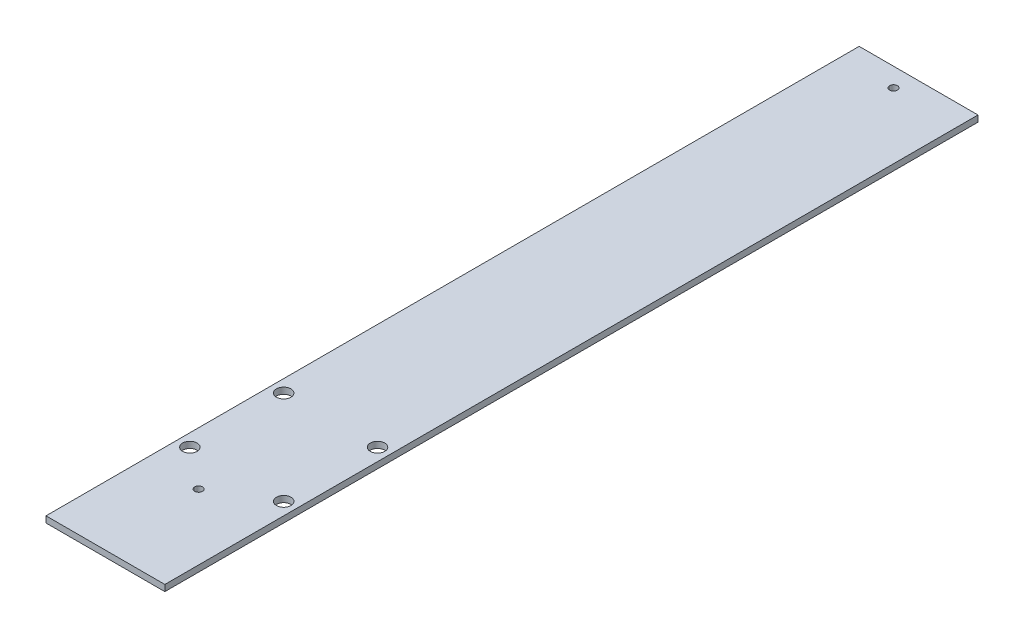
ISO-10303-21;
HEADER;
FILE_DESCRIPTION(('STEP AP214'),'2;1');
FILE_NAME('part.step','',(''),(''),'','','');
FILE_SCHEMA(('AUTOMOTIVE_DESIGN { 1 0 10303 214 1 1 1 1 }'));
ENDSEC;
DATA;
#1=APPLICATION_CONTEXT('core data for automotive mechanical design processes');
#2=APPLICATION_PROTOCOL_DEFINITION('international standard','automotive_design',2000,#1);
#3=PRODUCT_CONTEXT('',#1,'mechanical');
#4=PRODUCT('Part','Part','',(#3));
#5=PRODUCT_RELATED_PRODUCT_CATEGORY('part','',(#4));
#6=PRODUCT_DEFINITION_FORMATION('','',#4);
#7=PRODUCT_DEFINITION_CONTEXT('part definition',#1,'design');
#8=PRODUCT_DEFINITION('design','',#6,#7);
#9=PRODUCT_DEFINITION_SHAPE('','',#8);
#10=(LENGTH_UNIT() NAMED_UNIT(*) SI_UNIT(.MILLI.,.METRE.));
#11=(NAMED_UNIT(*) PLANE_ANGLE_UNIT() SI_UNIT($,.RADIAN.));
#12=(NAMED_UNIT(*) SI_UNIT($,.STERADIAN.) SOLID_ANGLE_UNIT());
#13=UNCERTAINTY_MEASURE_WITH_UNIT(LENGTH_MEASURE(1.E-05),#10,'distance_accuracy_value','');
#14=(GEOMETRIC_REPRESENTATION_CONTEXT(3) GLOBAL_UNCERTAINTY_ASSIGNED_CONTEXT((#13)) GLOBAL_UNIT_ASSIGNED_CONTEXT((#10,
#11,#12)) REPRESENTATION_CONTEXT('',''));
#15=CARTESIAN_POINT('',(0.,0.,0.));
#16=DIRECTION('',(0.,0.,1.));
#17=DIRECTION('',(1.,0.,0.));
#18=AXIS2_PLACEMENT_3D('',#15,#16,#17);
#19=CARTESIAN_POINT('',(107.95,0.,1449.0573));
#20=DIRECTION('',(0.,1.,0.));
#21=DIRECTION('',(0.,0.,1.));
#22=AXIS2_PLACEMENT_3D('',#19,#20,#21);
#23=CYLINDRICAL_SURFACE('',#22,7.93749999999992);
#24=DIRECTION('',(0.,1.,0.));
#25=VECTOR('',#24,1.);
#26=CARTESIAN_POINT('',(100.0125,0.,1449.0573));
#27=LINE('',#26,#25);
#28=CARTESIAN_POINT('',(100.0125,12.7,1449.0573));
#29=VERTEX_POINT('',#28);
#30=CARTESIAN_POINT('',(100.0125,0.,1449.0573));
#31=VERTEX_POINT('',#30);
#32=EDGE_CURVE('E11',#29,#31,#27,.F.);
#33=ORIENTED_EDGE('',*,*,#32,.F.);
#34=CARTESIAN_POINT('',(107.95,12.7,1449.0573));
#35=DIRECTION('',(0.,1.,0.));
#36=DIRECTION('',(0.,0.,1.));
#37=AXIS2_PLACEMENT_3D('',#34,#35,#36);
#38=CIRCLE('',#37,7.93749999999992);
#39=CARTESIAN_POINT('',(115.8875,12.7,1449.0573));
#40=VERTEX_POINT('',#39);
#41=EDGE_CURVE('E145',#29,#40,#38,.T.);
#42=ORIENTED_EDGE('',*,*,#41,.T.);
#43=DIRECTION('',(0.,1.,0.));
#44=VECTOR('',#43,1.);
#45=CARTESIAN_POINT('',(115.8875,0.,1449.0573));
#46=LINE('',#45,#44);
#47=CARTESIAN_POINT('',(115.8875,0.,1449.0573));
#48=VERTEX_POINT('',#47);
#49=EDGE_CURVE('E47',#48,#40,#46,.T.);
#50=ORIENTED_EDGE('',*,*,#49,.F.);
#51=CARTESIAN_POINT('',(107.95,0.,1449.0573));
#52=DIRECTION('',(0.,1.,0.));
#53=DIRECTION('',(0.,0.,1.));
#54=AXIS2_PLACEMENT_3D('',#51,#52,#53);
#55=CIRCLE('',#54,7.93749999999992);
#56=EDGE_CURVE('E231',#31,#48,#55,.T.);
#57=ORIENTED_EDGE('',*,*,#56,.F.);
#58=EDGE_LOOP('',(#33,#42,#50,#57));
#59=FACE_BOUND('',#58,.T.);
#60=ADVANCED_FACE('F38',(#59),#23,.F.);
#61=CARTESIAN_POINT('',(107.95,0.,38.1));
#62=DIRECTION('',(0.,1.,0.));
#63=DIRECTION('',(0.,0.,1.));
#64=AXIS2_PLACEMENT_3D('',#61,#62,#63);
#65=CYLINDRICAL_SURFACE('',#64,7.93749999999998);
#66=DIRECTION('',(0.,1.,0.));
#67=VECTOR('',#66,1.);
#68=CARTESIAN_POINT('',(100.0125,0.,38.1));
#69=LINE('',#68,#67);
#70=CARTESIAN_POINT('',(100.0125,12.7,38.1));
#71=VERTEX_POINT('',#70);
#72=CARTESIAN_POINT('',(100.0125,0.,38.1));
#73=VERTEX_POINT('',#72);
#74=EDGE_CURVE('E129',#71,#73,#69,.F.);
#75=ORIENTED_EDGE('',*,*,#74,.F.);
#76=CARTESIAN_POINT('',(107.95,12.7,38.1));
#77=DIRECTION('',(0.,1.,0.));
#78=DIRECTION('',(0.,0.,1.));
#79=AXIS2_PLACEMENT_3D('',#76,#77,#78);
#80=CIRCLE('',#79,7.93749999999998);
#81=CARTESIAN_POINT('',(115.8875,12.7,38.1));
#82=VERTEX_POINT('',#81);
#83=EDGE_CURVE('E157',#71,#82,#80,.T.);
#84=ORIENTED_EDGE('',*,*,#83,.T.);
#85=DIRECTION('',(0.,1.,0.));
#86=VECTOR('',#85,1.);
#87=CARTESIAN_POINT('',(115.8875,0.,38.1));
#88=LINE('',#87,#86);
#89=CARTESIAN_POINT('',(115.8875,0.,38.1));
#90=VERTEX_POINT('',#89);
#91=EDGE_CURVE('E126',#90,#82,#88,.T.);
#92=ORIENTED_EDGE('',*,*,#91,.F.);
#93=CARTESIAN_POINT('',(107.95,0.,38.1));
#94=DIRECTION('',(0.,1.,0.));
#95=DIRECTION('',(0.,0.,1.));
#96=AXIS2_PLACEMENT_3D('',#93,#94,#95);
#97=CIRCLE('',#96,7.93749999999998);
#98=EDGE_CURVE('E149',#73,#90,#97,.T.);
#99=ORIENTED_EDGE('',*,*,#98,.F.);
#100=EDGE_LOOP('',(#75,#84,#92,#99));
#101=FACE_BOUND('',#100,.T.);
#102=ADVANCED_FACE('F188',(#101),#65,.F.);
#103=CARTESIAN_POINT('',(0.,12.7,0.));
#104=DIRECTION('',(1.,0.,0.));
#105=DIRECTION('',(0.,0.,-1.));
#106=AXIS2_PLACEMENT_3D('',#103,#104,#105);
#107=PLANE('',#106);
#108=DIRECTION('',(0.,0.,1.));
#109=VECTOR('',#108,1.);
#110=CARTESIAN_POINT('',(0.,0.,0.));
#111=LINE('',#110,#109);
#112=CARTESIAN_POINT('',(0.,0.,0.));
#113=VERTEX_POINT('',#112);
#114=CARTESIAN_POINT('',(2.02189186539228E-13,0.,1651.));
#115=VERTEX_POINT('',#114);
#116=EDGE_CURVE('E125',#113,#115,#111,.T.);
#117=ORIENTED_EDGE('',*,*,#116,.T.);
#118=DIRECTION('',(0.,-1.,0.));
#119=VECTOR('',#118,1.);
#120=CARTESIAN_POINT('',(2.02189186539228E-13,12.7,1651.));
#121=LINE('',#120,#119);
#122=CARTESIAN_POINT('',(2.02189186539228E-13,12.7,1651.));
#123=VERTEX_POINT('',#122);
#124=EDGE_CURVE('E106',#123,#115,#121,.T.);
#125=ORIENTED_EDGE('',*,*,#124,.F.);
#126=DIRECTION('',(0.,0.,1.));
#127=VECTOR('',#126,1.);
#128=CARTESIAN_POINT('',(0.,12.7,0.));
#129=LINE('',#128,#127);
#130=CARTESIAN_POINT('',(0.,12.7,0.));
#131=VERTEX_POINT('',#130);
#132=EDGE_CURVE('E113',#131,#123,#129,.T.);
#133=ORIENTED_EDGE('',*,*,#132,.F.);
#134=DIRECTION('',(0.,-1.,0.));
#135=VECTOR('',#134,1.);
#136=CARTESIAN_POINT('',(0.,12.7,0.));
#137=LINE('',#136,#135);
#138=EDGE_CURVE('E163',#131,#113,#137,.T.);
#139=ORIENTED_EDGE('',*,*,#138,.T.);
#140=EDGE_LOOP('',(#117,#125,#133,#139));
#141=FACE_BOUND('',#140,.T.);
#142=ADVANCED_FACE('F40',(#141),#107,.F.);
#143=CARTESIAN_POINT('',(2.02189186539228E-13,12.7,1651.));
#144=DIRECTION('',(0.,0.,-1.));
#145=DIRECTION('',(-1.,0.,0.));
#146=AXIS2_PLACEMENT_3D('',#143,#144,#145);
#147=PLANE('',#146);
#148=DIRECTION('',(1.,0.,0.));
#149=VECTOR('',#148,1.);
#150=CARTESIAN_POINT('',(2.02189186539228E-13,0.,1651.));
#151=LINE('',#150,#149);
#152=CARTESIAN_POINT('',(241.3,0.,1651.));
#153=VERTEX_POINT('',#152);
#154=EDGE_CURVE('E165',#115,#153,#151,.T.);
#155=ORIENTED_EDGE('',*,*,#154,.T.);
#156=DIRECTION('',(0.,-1.,0.));
#157=VECTOR('',#156,1.);
#158=CARTESIAN_POINT('',(241.3,12.7,1651.));
#159=LINE('',#158,#157);
#160=CARTESIAN_POINT('',(241.3,12.7,1651.));
#161=VERTEX_POINT('',#160);
#162=EDGE_CURVE('E109',#161,#153,#159,.T.);
#163=ORIENTED_EDGE('',*,*,#162,.F.);
#164=DIRECTION('',(1.,0.,0.));
#165=VECTOR('',#164,1.);
#166=CARTESIAN_POINT('',(2.02189186539228E-13,12.7,1651.));
#167=LINE('',#166,#165);
#168=EDGE_CURVE('E102',#123,#161,#167,.T.);
#169=ORIENTED_EDGE('',*,*,#168,.F.);
#170=ORIENTED_EDGE('',*,*,#124,.T.);
#171=EDGE_LOOP('',(#155,#163,#169,#170));
#172=FACE_BOUND('',#171,.T.);
#173=ADVANCED_FACE('F104',(#172),#147,.F.);
#174=CARTESIAN_POINT('',(241.3,12.7,0.));
#175=DIRECTION('',(-1.,0.,0.));
#176=DIRECTION('',(0.,0.,1.));
#177=AXIS2_PLACEMENT_3D('',#174,#175,#176);
#178=PLANE('',#177);
#179=DIRECTION('',(0.,0.,-1.));
#180=VECTOR('',#179,1.);
#181=CARTESIAN_POINT('',(241.3,0.,0.));
#182=LINE('',#181,#180);
#183=CARTESIAN_POINT('',(241.3,0.,0.));
#184=VERTEX_POINT('',#183);
#185=EDGE_CURVE('E167',#153,#184,#182,.T.);
#186=ORIENTED_EDGE('',*,*,#185,.T.);
#187=DIRECTION('',(0.,-1.,0.));
#188=VECTOR('',#187,1.);
#189=CARTESIAN_POINT('',(241.3,12.7,0.));
#190=LINE('',#189,#188);
#191=CARTESIAN_POINT('',(241.3,12.7,0.));
#192=VERTEX_POINT('',#191);
#193=EDGE_CURVE('E131',#192,#184,#190,.T.);
#194=ORIENTED_EDGE('',*,*,#193,.F.);
#195=DIRECTION('',(0.,0.,-1.));
#196=VECTOR('',#195,1.);
#197=CARTESIAN_POINT('',(241.3,12.7,0.));
#198=LINE('',#197,#196);
#199=EDGE_CURVE('E112',#161,#192,#198,.T.);
#200=ORIENTED_EDGE('',*,*,#199,.F.);
#201=ORIENTED_EDGE('',*,*,#162,.T.);
#202=EDGE_LOOP('',(#186,#194,#200,#201));
#203=FACE_BOUND('',#202,.T.);
#204=ADVANCED_FACE('F179',(#203),#178,.F.);
#205=CARTESIAN_POINT('',(0.,12.7,0.));
#206=DIRECTION('',(0.,0.,1.));
#207=DIRECTION('',(1.,0.,0.));
#208=AXIS2_PLACEMENT_3D('',#205,#206,#207);
#209=PLANE('',#208);
#210=DIRECTION('',(-1.,0.,0.));
#211=VECTOR('',#210,1.);
#212=CARTESIAN_POINT('',(0.,0.,0.));
#213=LINE('',#212,#211);
#214=EDGE_CURVE('E122',#184,#113,#213,.T.);
#215=ORIENTED_EDGE('',*,*,#214,.T.);
#216=ORIENTED_EDGE('',*,*,#138,.F.);
#217=DIRECTION('',(-1.,0.,0.));
#218=VECTOR('',#217,1.);
#219=CARTESIAN_POINT('',(0.,12.7,0.));
#220=LINE('',#219,#218);
#221=EDGE_CURVE('E118',#192,#131,#220,.T.);
#222=ORIENTED_EDGE('',*,*,#221,.F.);
#223=ORIENTED_EDGE('',*,*,#193,.T.);
#224=EDGE_LOOP('',(#215,#216,#222,#223));
#225=FACE_BOUND('',#224,.T.);
#226=ADVANCED_FACE('F174',(#225),#209,.F.);
#227=CARTESIAN_POINT('',(0.,12.7,0.));
#228=DIRECTION('',(0.,1.,0.));
#229=DIRECTION('',(0.,0.,1.));
#230=AXIS2_PLACEMENT_3D('',#227,#228,#229);
#231=PLANE('',#230);
#232=CARTESIAN_POINT('',(25.4000000000002,12.7,1193.8));
#233=DIRECTION('',(0.,-1.,0.));
#234=DIRECTION('',(0.,0.,-1.));
#235=AXIS2_PLACEMENT_3D('',#232,#233,#234);
#236=CIRCLE('',#235,14.72946);
#237=CARTESIAN_POINT('',(25.4000000000002,12.7,1179.07054));
#238=VERTEX_POINT('',#237);
#239=EDGE_CURVE('E219',#238,#238,#236,.T.);
#240=ORIENTED_EDGE('',*,*,#239,.T.);
#241=EDGE_LOOP('',(#240));
#242=FACE_BOUND('',#241,.T.);
#243=CARTESIAN_POINT('',(25.4000000000002,12.7,1384.3));
#244=DIRECTION('',(0.,-1.,0.));
#245=DIRECTION('',(0.,0.,-1.));
#246=AXIS2_PLACEMENT_3D('',#243,#244,#245);
#247=CIRCLE('',#246,14.7294599999999);
#248=CARTESIAN_POINT('',(25.4000000000002,12.7,1369.57054));
#249=VERTEX_POINT('',#248);
#250=EDGE_CURVE('E223',#249,#249,#247,.T.);
#251=ORIENTED_EDGE('',*,*,#250,.T.);
#252=EDGE_LOOP('',(#251));
#253=FACE_BOUND('',#252,.T.);
#254=CARTESIAN_POINT('',(215.9,12.7,1384.3));
#255=DIRECTION('',(0.,-1.,0.));
#256=DIRECTION('',(0.,0.,-1.));
#257=AXIS2_PLACEMENT_3D('',#254,#255,#256);
#258=CIRCLE('',#257,14.72946);
#259=CARTESIAN_POINT('',(215.9,12.7,1369.57054));
#260=VERTEX_POINT('',#259);
#261=EDGE_CURVE('E227',#260,#260,#258,.T.);
#262=ORIENTED_EDGE('',*,*,#261,.T.);
#263=EDGE_LOOP('',(#262));
#264=FACE_BOUND('',#263,.T.);
#265=CARTESIAN_POINT('',(215.9,12.7,1193.8));
#266=DIRECTION('',(0.,-1.,0.));
#267=DIRECTION('',(0.,0.,-1.));
#268=AXIS2_PLACEMENT_3D('',#265,#266,#267);
#269=CIRCLE('',#268,14.7294599999999);
#270=CARTESIAN_POINT('',(215.9,12.7,1179.07054));
#271=VERTEX_POINT('',#270);
#272=EDGE_CURVE('E230',#271,#271,#269,.T.);
#273=ORIENTED_EDGE('',*,*,#272,.T.);
#274=EDGE_LOOP('',(#273));
#275=FACE_BOUND('',#274,.T.);
#276=EDGE_CURVE('E141',#40,#29,#38,.T.);
#277=ORIENTED_EDGE('',*,*,#276,.F.);
#278=ORIENTED_EDGE('',*,*,#41,.F.);
#279=EDGE_LOOP('',(#277,#278));
#280=FACE_BOUND('',#279,.T.);
#281=EDGE_CURVE('E158',#82,#71,#80,.T.);
#282=ORIENTED_EDGE('',*,*,#281,.F.);
#283=ORIENTED_EDGE('',*,*,#83,.F.);
#284=EDGE_LOOP('',(#282,#283));
#285=FACE_BOUND('',#284,.T.);
#286=ORIENTED_EDGE('',*,*,#132,.T.);
#287=ORIENTED_EDGE('',*,*,#168,.T.);
#288=ORIENTED_EDGE('',*,*,#199,.T.);
#289=ORIENTED_EDGE('',*,*,#221,.T.);
#290=EDGE_LOOP('',(#286,#287,#288,#289));
#291=FACE_BOUND('',#290,.T.);
#292=ADVANCED_FACE('F116',(#242,#253,#264,#275,#280,#285,#291),#231,.T.);
#293=CARTESIAN_POINT('',(0.,0.,0.));
#294=DIRECTION('',(0.,1.,0.));
#295=DIRECTION('',(0.,0.,1.));
#296=AXIS2_PLACEMENT_3D('',#293,#294,#295);
#297=PLANE('',#296);
#298=CARTESIAN_POINT('',(25.4000000000002,0.,1193.8));
#299=DIRECTION('',(0.,-1.,0.));
#300=DIRECTION('',(0.,0.,-1.));
#301=AXIS2_PLACEMENT_3D('',#298,#299,#300);
#302=CIRCLE('',#301,14.72946);
#303=CARTESIAN_POINT('',(25.4000000000002,0.,1179.07054));
#304=VERTEX_POINT('',#303);
#305=EDGE_CURVE('E244',#304,#304,#302,.T.);
#306=ORIENTED_EDGE('',*,*,#305,.F.);
#307=EDGE_LOOP('',(#306));
#308=FACE_BOUND('',#307,.T.);
#309=CARTESIAN_POINT('',(25.4000000000002,0.,1384.3));
#310=DIRECTION('',(0.,-1.,0.));
#311=DIRECTION('',(0.,0.,-1.));
#312=AXIS2_PLACEMENT_3D('',#309,#310,#311);
#313=CIRCLE('',#312,14.7294599999999);
#314=CARTESIAN_POINT('',(25.4000000000002,0.,1369.57054));
#315=VERTEX_POINT('',#314);
#316=EDGE_CURVE('E240',#315,#315,#313,.T.);
#317=ORIENTED_EDGE('',*,*,#316,.F.);
#318=EDGE_LOOP('',(#317));
#319=FACE_BOUND('',#318,.T.);
#320=CARTESIAN_POINT('',(215.9,0.,1384.3));
#321=DIRECTION('',(0.,-1.,0.));
#322=DIRECTION('',(0.,0.,-1.));
#323=AXIS2_PLACEMENT_3D('',#320,#321,#322);
#324=CIRCLE('',#323,14.72946);
#325=CARTESIAN_POINT('',(215.9,0.,1369.57054));
#326=VERTEX_POINT('',#325);
#327=EDGE_CURVE('E236',#326,#326,#324,.T.);
#328=ORIENTED_EDGE('',*,*,#327,.F.);
#329=EDGE_LOOP('',(#328));
#330=FACE_BOUND('',#329,.T.);
#331=CARTESIAN_POINT('',(215.9,0.,1193.8));
#332=DIRECTION('',(0.,-1.,0.));
#333=DIRECTION('',(0.,0.,-1.));
#334=AXIS2_PLACEMENT_3D('',#331,#332,#333);
#335=CIRCLE('',#334,14.7294599999999);
#336=CARTESIAN_POINT('',(215.9,0.,1179.07054));
#337=VERTEX_POINT('',#336);
#338=EDGE_CURVE('E232',#337,#337,#335,.T.);
#339=ORIENTED_EDGE('',*,*,#338,.F.);
#340=EDGE_LOOP('',(#339));
#341=FACE_BOUND('',#340,.T.);
#342=EDGE_CURVE('E143',#48,#31,#55,.T.);
#343=ORIENTED_EDGE('',*,*,#342,.T.);
#344=ORIENTED_EDGE('',*,*,#56,.T.);
#345=EDGE_LOOP('',(#343,#344));
#346=FACE_BOUND('',#345,.T.);
#347=EDGE_CURVE('E151',#90,#73,#97,.T.);
#348=ORIENTED_EDGE('',*,*,#347,.T.);
#349=ORIENTED_EDGE('',*,*,#98,.T.);
#350=EDGE_LOOP('',(#348,#349));
#351=FACE_BOUND('',#350,.T.);
#352=ORIENTED_EDGE('',*,*,#116,.F.);
#353=ORIENTED_EDGE('',*,*,#214,.F.);
#354=ORIENTED_EDGE('',*,*,#185,.F.);
#355=ORIENTED_EDGE('',*,*,#154,.F.);
#356=EDGE_LOOP('',(#352,#353,#354,#355));
#357=FACE_BOUND('',#356,.T.);
#358=ADVANCED_FACE('F178',(#308,#319,#330,#341,#346,#351,#357),#297,.F.);
#359=ORIENTED_EDGE('',*,*,#281,.T.);
#360=ORIENTED_EDGE('',*,*,#74,.T.);
#361=ORIENTED_EDGE('',*,*,#347,.F.);
#362=ORIENTED_EDGE('',*,*,#91,.T.);
#363=EDGE_LOOP('',(#359,#360,#361,#362));
#364=FACE_BOUND('',#363,.T.);
#365=ADVANCED_FACE('F197',(#364),#65,.F.);
#366=ORIENTED_EDGE('',*,*,#276,.T.);
#367=ORIENTED_EDGE('',*,*,#32,.T.);
#368=ORIENTED_EDGE('',*,*,#342,.F.);
#369=ORIENTED_EDGE('',*,*,#49,.T.);
#370=EDGE_LOOP('',(#366,#367,#368,#369));
#371=FACE_BOUND('',#370,.T.);
#372=ADVANCED_FACE('F139',(#371),#23,.F.);
#373=CARTESIAN_POINT('',(215.9,12.7,1193.8));
#374=DIRECTION('',(0.,-1.,0.));
#375=DIRECTION('',(0.,0.,-1.));
#376=AXIS2_PLACEMENT_3D('',#373,#374,#375);
#377=CYLINDRICAL_SURFACE('',#376,14.7294599999999);
#378=ORIENTED_EDGE('',*,*,#272,.F.);
#379=EDGE_LOOP('',(#378));
#380=FACE_BOUND('',#379,.T.);
#381=ORIENTED_EDGE('',*,*,#338,.T.);
#382=EDGE_LOOP('',(#381));
#383=FACE_BOUND('',#382,.T.);
#384=ADVANCED_FACE('F200',(#380,#383),#377,.F.);
#385=CARTESIAN_POINT('',(215.9,12.7,1384.3));
#386=DIRECTION('',(0.,-1.,0.));
#387=DIRECTION('',(0.,0.,-1.));
#388=AXIS2_PLACEMENT_3D('',#385,#386,#387);
#389=CYLINDRICAL_SURFACE('',#388,14.72946);
#390=ORIENTED_EDGE('',*,*,#261,.F.);
#391=EDGE_LOOP('',(#390));
#392=FACE_BOUND('',#391,.T.);
#393=ORIENTED_EDGE('',*,*,#327,.T.);
#394=EDGE_LOOP('',(#393));
#395=FACE_BOUND('',#394,.T.);
#396=ADVANCED_FACE('F205',(#392,#395),#389,.F.);
#397=CARTESIAN_POINT('',(25.4000000000002,12.7,1384.3));
#398=DIRECTION('',(0.,-1.,0.));
#399=DIRECTION('',(0.,0.,-1.));
#400=AXIS2_PLACEMENT_3D('',#397,#398,#399);
#401=CYLINDRICAL_SURFACE('',#400,14.7294599999999);
#402=ORIENTED_EDGE('',*,*,#250,.F.);
#403=EDGE_LOOP('',(#402));
#404=FACE_BOUND('',#403,.T.);
#405=ORIENTED_EDGE('',*,*,#316,.T.);
#406=EDGE_LOOP('',(#405));
#407=FACE_BOUND('',#406,.T.);
#408=ADVANCED_FACE('F266',(#404,#407),#401,.F.);
#409=CARTESIAN_POINT('',(25.4000000000002,12.7,1193.8));
#410=DIRECTION('',(0.,-1.,0.));
#411=DIRECTION('',(0.,0.,-1.));
#412=AXIS2_PLACEMENT_3D('',#409,#410,#411);
#413=CYLINDRICAL_SURFACE('',#412,14.72946);
#414=ORIENTED_EDGE('',*,*,#239,.F.);
#415=EDGE_LOOP('',(#414));
#416=FACE_BOUND('',#415,.T.);
#417=ORIENTED_EDGE('',*,*,#305,.T.);
#418=EDGE_LOOP('',(#417));
#419=FACE_BOUND('',#418,.T.);
#420=ADVANCED_FACE('F249',(#416,#419),#413,.F.);
#421=CLOSED_SHELL('',(#60,#102,#142,#173,#204,#226,#292,#358,#365,#372,#384,#396,#408,#420));
#422=MANIFOLD_SOLID_BREP('B2',#421);
#423=ADVANCED_BREP_SHAPE_REPRESENTATION('',(#18,#422),#14);
#424=SHAPE_DEFINITION_REPRESENTATION(#9,#423);
ENDSEC;
END-ISO-10303-21;
